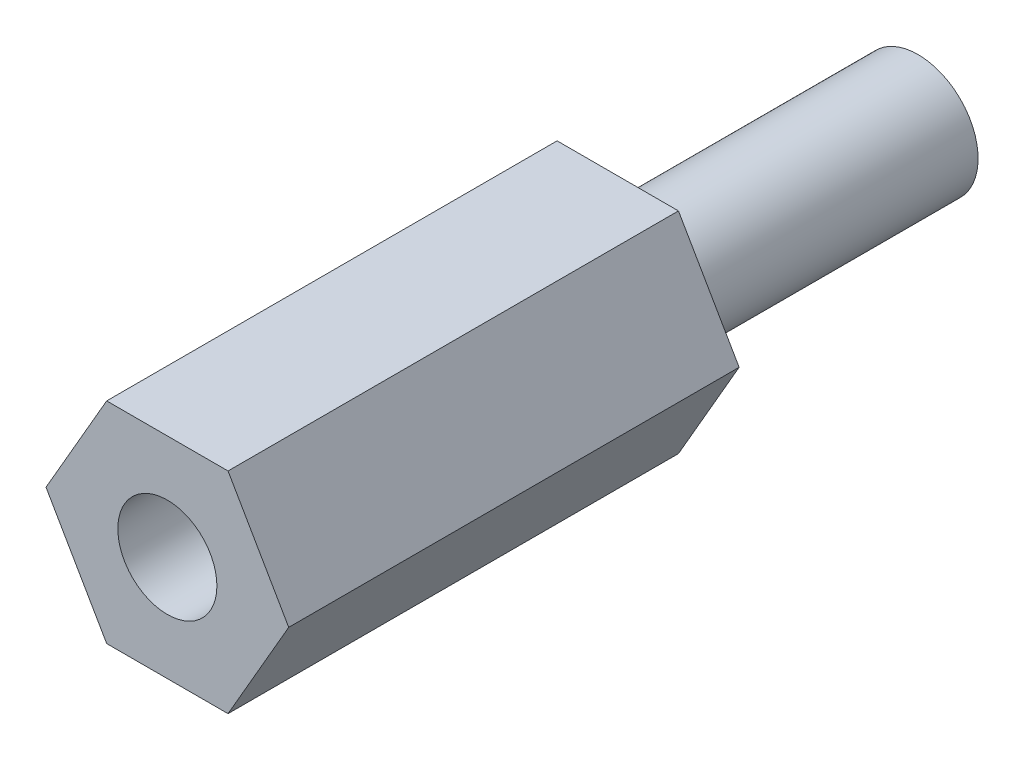
ISO-10303-21;
HEADER;
FILE_DESCRIPTION(('STEP AP214'),'2;1');
FILE_NAME('part.step','',(''),(''),'','','');
FILE_SCHEMA(('AUTOMOTIVE_DESIGN { 1 0 10303 214 1 1 1 1 }'));
ENDSEC;
DATA;
#1=APPLICATION_CONTEXT('core data for automotive mechanical design processes');
#2=APPLICATION_PROTOCOL_DEFINITION('international standard','automotive_design',2000,#1);
#3=PRODUCT_CONTEXT('',#1,'mechanical');
#4=PRODUCT('Part','Part','',(#3));
#5=PRODUCT_RELATED_PRODUCT_CATEGORY('part','',(#4));
#6=PRODUCT_DEFINITION_FORMATION('','',#4);
#7=PRODUCT_DEFINITION_CONTEXT('part definition',#1,'design');
#8=PRODUCT_DEFINITION('design','',#6,#7);
#9=PRODUCT_DEFINITION_SHAPE('','',#8);
#10=(LENGTH_UNIT() NAMED_UNIT(*) SI_UNIT(.MILLI.,.METRE.));
#11=(NAMED_UNIT(*) PLANE_ANGLE_UNIT() SI_UNIT($,.RADIAN.));
#12=(NAMED_UNIT(*) SI_UNIT($,.STERADIAN.) SOLID_ANGLE_UNIT());
#13=UNCERTAINTY_MEASURE_WITH_UNIT(LENGTH_MEASURE(1.E-05),#10,'distance_accuracy_value','');
#14=(GEOMETRIC_REPRESENTATION_CONTEXT(3) GLOBAL_UNCERTAINTY_ASSIGNED_CONTEXT((#13)) GLOBAL_UNIT_ASSIGNED_CONTEXT((#10,
#11,#12)) REPRESENTATION_CONTEXT('',''));
#15=CARTESIAN_POINT('',(0.,0.,0.));
#16=DIRECTION('',(0.,0.,1.));
#17=DIRECTION('',(1.,0.,0.));
#18=AXIS2_PLACEMENT_3D('',#15,#16,#17);
#19=CARTESIAN_POINT('',(2.02072594216369,3.5,15.));
#20=DIRECTION('',(0.,-1.,0.));
#21=DIRECTION('',(1.,0.,0.));
#22=AXIS2_PLACEMENT_3D('',#19,#20,#21);
#23=PLANE('',#22);
#24=DIRECTION('',(-1.,0.,0.));
#25=VECTOR('',#24,1.);
#26=CARTESIAN_POINT('',(2.02072594216369,3.5,0.));
#27=LINE('',#26,#25);
#28=CARTESIAN_POINT('',(2.02072594216369,3.5,0.));
#29=VERTEX_POINT('',#28);
#30=CARTESIAN_POINT('',(-2.02072594216369,3.5,0.));
#31=VERTEX_POINT('',#30);
#32=EDGE_CURVE('E125',#29,#31,#27,.T.);
#33=ORIENTED_EDGE('',*,*,#32,.T.);
#34=DIRECTION('',(0.,0.,-1.));
#35=VECTOR('',#34,1.);
#36=CARTESIAN_POINT('',(-2.02072594216369,3.5,15.));
#37=LINE('',#36,#35);
#38=CARTESIAN_POINT('',(-2.02072594216369,3.5,15.));
#39=VERTEX_POINT('',#38);
#40=EDGE_CURVE('E40',#39,#31,#37,.T.);
#41=ORIENTED_EDGE('',*,*,#40,.F.);
#42=DIRECTION('',(-1.,0.,0.));
#43=VECTOR('',#42,1.);
#44=CARTESIAN_POINT('',(2.02072594216369,3.5,15.));
#45=LINE('',#44,#43);
#46=CARTESIAN_POINT('',(2.02072594216369,3.5,15.));
#47=VERTEX_POINT('',#46);
#48=EDGE_CURVE('E136',#47,#39,#45,.T.);
#49=ORIENTED_EDGE('',*,*,#48,.F.);
#50=DIRECTION('',(0.,0.,-1.));
#51=VECTOR('',#50,1.);
#52=CARTESIAN_POINT('',(2.02072594216369,3.5,15.));
#53=LINE('',#52,#51);
#54=EDGE_CURVE('E121',#47,#29,#53,.T.);
#55=ORIENTED_EDGE('',*,*,#54,.T.);
#56=EDGE_LOOP('',(#33,#41,#49,#55));
#57=FACE_BOUND('',#56,.T.);
#58=ADVANCED_FACE('F37',(#57),#23,.F.);
#59=CARTESIAN_POINT('',(-2.02072594216369,3.5,15.));
#60=DIRECTION('',(0.866025403784439,-0.5,0.));
#61=DIRECTION('',(0.5,0.866025403784439,0.));
#62=AXIS2_PLACEMENT_3D('',#59,#60,#61);
#63=PLANE('',#62);
#64=DIRECTION('',(-0.5,-0.866025403784439,0.));
#65=VECTOR('',#64,1.);
#66=CARTESIAN_POINT('',(-2.02072594216369,3.5,0.));
#67=LINE('',#66,#65);
#68=CARTESIAN_POINT('',(-4.04145188432738,0.,0.));
#69=VERTEX_POINT('',#68);
#70=EDGE_CURVE('E128',#31,#69,#67,.T.);
#71=ORIENTED_EDGE('',*,*,#70,.T.);
#72=DIRECTION('',(0.,0.,-1.));
#73=VECTOR('',#72,1.);
#74=CARTESIAN_POINT('',(-4.04145188432738,0.,15.));
#75=LINE('',#74,#73);
#76=CARTESIAN_POINT('',(-4.04145188432738,0.,15.));
#77=VERTEX_POINT('',#76);
#78=EDGE_CURVE('E139',#77,#69,#75,.T.);
#79=ORIENTED_EDGE('',*,*,#78,.F.);
#80=DIRECTION('',(-0.5,-0.866025403784439,0.));
#81=VECTOR('',#80,1.);
#82=CARTESIAN_POINT('',(-2.02072594216369,3.5,15.));
#83=LINE('',#82,#81);
#84=EDGE_CURVE('E93',#39,#77,#83,.T.);
#85=ORIENTED_EDGE('',*,*,#84,.F.);
#86=ORIENTED_EDGE('',*,*,#40,.T.);
#87=EDGE_LOOP('',(#71,#79,#85,#86));
#88=FACE_BOUND('',#87,.T.);
#89=ADVANCED_FACE('F144',(#88),#63,.F.);
#90=CARTESIAN_POINT('',(-4.04145188432738,0.,15.));
#91=DIRECTION('',(0.866025403784439,0.5,0.));
#92=DIRECTION('',(-0.5,0.866025403784439,0.));
#93=AXIS2_PLACEMENT_3D('',#90,#91,#92);
#94=PLANE('',#93);
#95=DIRECTION('',(0.5,-0.866025403784439,0.));
#96=VECTOR('',#95,1.);
#97=CARTESIAN_POINT('',(-4.04145188432738,0.,0.));
#98=LINE('',#97,#96);
#99=CARTESIAN_POINT('',(-2.02072594216369,-3.5,0.));
#100=VERTEX_POINT('',#99);
#101=EDGE_CURVE('E131',#69,#100,#98,.T.);
#102=ORIENTED_EDGE('',*,*,#101,.T.);
#103=DIRECTION('',(0.,0.,-1.));
#104=VECTOR('',#103,1.);
#105=CARTESIAN_POINT('',(-2.02072594216369,-3.5,15.));
#106=LINE('',#105,#104);
#107=CARTESIAN_POINT('',(-2.02072594216369,-3.5,15.));
#108=VERTEX_POINT('',#107);
#109=EDGE_CURVE('E116',#108,#100,#106,.T.);
#110=ORIENTED_EDGE('',*,*,#109,.F.);
#111=DIRECTION('',(0.5,-0.866025403784439,0.));
#112=VECTOR('',#111,1.);
#113=CARTESIAN_POINT('',(-4.04145188432738,0.,15.));
#114=LINE('',#113,#112);
#115=EDGE_CURVE('E107',#77,#108,#114,.T.);
#116=ORIENTED_EDGE('',*,*,#115,.F.);
#117=ORIENTED_EDGE('',*,*,#78,.T.);
#118=EDGE_LOOP('',(#102,#110,#116,#117));
#119=FACE_BOUND('',#118,.T.);
#120=ADVANCED_FACE('F150',(#119),#94,.F.);
#121=CARTESIAN_POINT('',(-2.02072594216369,-3.5,15.));
#122=DIRECTION('',(0.,1.,0.));
#123=DIRECTION('',(-1.,0.,0.));
#124=AXIS2_PLACEMENT_3D('',#121,#122,#123);
#125=PLANE('',#124);
#126=DIRECTION('',(1.,0.,0.));
#127=VECTOR('',#126,1.);
#128=CARTESIAN_POINT('',(-2.02072594216369,-3.5,0.));
#129=LINE('',#128,#127);
#130=CARTESIAN_POINT('',(2.02072594216369,-3.5,0.));
#131=VERTEX_POINT('',#130);
#132=EDGE_CURVE('E115',#100,#131,#129,.T.);
#133=ORIENTED_EDGE('',*,*,#132,.T.);
#134=DIRECTION('',(0.,0.,-1.));
#135=VECTOR('',#134,1.);
#136=CARTESIAN_POINT('',(2.02072594216369,-3.5,15.));
#137=LINE('',#136,#135);
#138=CARTESIAN_POINT('',(2.02072594216369,-3.5,15.));
#139=VERTEX_POINT('',#138);
#140=EDGE_CURVE('E112',#139,#131,#137,.T.);
#141=ORIENTED_EDGE('',*,*,#140,.F.);
#142=DIRECTION('',(1.,0.,0.));
#143=VECTOR('',#142,1.);
#144=CARTESIAN_POINT('',(-2.02072594216369,-3.5,15.));
#145=LINE('',#144,#143);
#146=EDGE_CURVE('E101',#108,#139,#145,.T.);
#147=ORIENTED_EDGE('',*,*,#146,.F.);
#148=ORIENTED_EDGE('',*,*,#109,.T.);
#149=EDGE_LOOP('',(#133,#141,#147,#148));
#150=FACE_BOUND('',#149,.T.);
#151=ADVANCED_FACE('F113',(#150),#125,.F.);
#152=CARTESIAN_POINT('',(2.02072594216369,-3.5,15.));
#153=DIRECTION('',(-0.866025403784439,0.5,0.));
#154=DIRECTION('',(-0.5,-0.866025403784439,0.));
#155=AXIS2_PLACEMENT_3D('',#152,#153,#154);
#156=PLANE('',#155);
#157=DIRECTION('',(0.5,0.866025403784439,0.));
#158=VECTOR('',#157,1.);
#159=CARTESIAN_POINT('',(2.02072594216369,-3.5,0.));
#160=LINE('',#159,#158);
#161=CARTESIAN_POINT('',(4.04145188432738,0.,0.));
#162=VERTEX_POINT('',#161);
#163=EDGE_CURVE('E78',#131,#162,#160,.T.);
#164=ORIENTED_EDGE('',*,*,#163,.T.);
#165=DIRECTION('',(0.,0.,-1.));
#166=VECTOR('',#165,1.);
#167=CARTESIAN_POINT('',(4.04145188432738,0.,15.));
#168=LINE('',#167,#166);
#169=CARTESIAN_POINT('',(4.04145188432738,0.,15.));
#170=VERTEX_POINT('',#169);
#171=EDGE_CURVE('E117',#170,#162,#168,.T.);
#172=ORIENTED_EDGE('',*,*,#171,.F.);
#173=DIRECTION('',(0.5,0.866025403784439,0.));
#174=VECTOR('',#173,1.);
#175=CARTESIAN_POINT('',(2.02072594216369,-3.5,15.));
#176=LINE('',#175,#174);
#177=EDGE_CURVE('E105',#139,#170,#176,.T.);
#178=ORIENTED_EDGE('',*,*,#177,.F.);
#179=ORIENTED_EDGE('',*,*,#140,.T.);
#180=EDGE_LOOP('',(#164,#172,#178,#179));
#181=FACE_BOUND('',#180,.T.);
#182=ADVANCED_FACE('F119',(#181),#156,.F.);
#183=CARTESIAN_POINT('',(4.04145188432738,0.,15.));
#184=DIRECTION('',(-0.866025403784439,-0.5,0.));
#185=DIRECTION('',(0.5,-0.866025403784439,0.));
#186=AXIS2_PLACEMENT_3D('',#183,#184,#185);
#187=PLANE('',#186);
#188=DIRECTION('',(-0.5,0.866025403784438,0.));
#189=VECTOR('',#188,1.);
#190=CARTESIAN_POINT('',(4.04145188432738,0.,0.));
#191=LINE('',#190,#189);
#192=EDGE_CURVE('E84',#162,#29,#191,.T.);
#193=ORIENTED_EDGE('',*,*,#192,.T.);
#194=ORIENTED_EDGE('',*,*,#54,.F.);
#195=DIRECTION('',(-0.5,0.866025403784438,0.));
#196=VECTOR('',#195,1.);
#197=CARTESIAN_POINT('',(4.04145188432738,0.,15.));
#198=LINE('',#197,#196);
#199=EDGE_CURVE('E54',#170,#47,#198,.T.);
#200=ORIENTED_EDGE('',*,*,#199,.F.);
#201=ORIENTED_EDGE('',*,*,#171,.T.);
#202=EDGE_LOOP('',(#193,#194,#200,#201));
#203=FACE_BOUND('',#202,.T.);
#204=ADVANCED_FACE('F166',(#203),#187,.F.);
#205=CARTESIAN_POINT('',(0.,0.,15.));
#206=DIRECTION('',(0.,0.,1.));
#207=DIRECTION('',(1.,0.,0.));
#208=AXIS2_PLACEMENT_3D('',#205,#206,#207);
#209=PLANE('',#208);
#210=CARTESIAN_POINT('',(0.,0.,15.));
#211=DIRECTION('',(0.,0.,1.));
#212=DIRECTION('',(1.,0.,0.));
#213=AXIS2_PLACEMENT_3D('',#210,#211,#212);
#214=CIRCLE('',#213,1.65);
#215=CARTESIAN_POINT('',(1.65,0.,15.));
#216=VERTEX_POINT('',#215);
#217=EDGE_CURVE('E159',#216,#216,#214,.T.);
#218=ORIENTED_EDGE('',*,*,#217,.F.);
#219=EDGE_LOOP('',(#218));
#220=FACE_BOUND('',#219,.T.);
#221=ORIENTED_EDGE('',*,*,#48,.T.);
#222=ORIENTED_EDGE('',*,*,#84,.T.);
#223=ORIENTED_EDGE('',*,*,#115,.T.);
#224=ORIENTED_EDGE('',*,*,#146,.T.);
#225=ORIENTED_EDGE('',*,*,#177,.T.);
#226=ORIENTED_EDGE('',*,*,#199,.T.);
#227=EDGE_LOOP('',(#221,#222,#223,#224,#225,#226));
#228=FACE_BOUND('',#227,.T.);
#229=ADVANCED_FACE('F103',(#220,#228),#209,.T.);
#230=CARTESIAN_POINT('',(0.,0.,0.));
#231=DIRECTION('',(0.,0.,1.));
#232=DIRECTION('',(1.,0.,0.));
#233=AXIS2_PLACEMENT_3D('',#230,#231,#232);
#234=PLANE('',#233);
#235=CARTESIAN_POINT('',(0.,0.,0.));
#236=DIRECTION('',(0.,0.,-1.));
#237=DIRECTION('',(-1.,0.,0.));
#238=AXIS2_PLACEMENT_3D('',#235,#236,#237);
#239=CIRCLE('',#238,2.);
#240=CARTESIAN_POINT('',(-2.,0.,0.));
#241=VERTEX_POINT('',#240);
#242=EDGE_CURVE('E11',#241,#241,#239,.T.);
#243=ORIENTED_EDGE('',*,*,#242,.F.);
#244=EDGE_LOOP('',(#243));
#245=FACE_BOUND('',#244,.T.);
#246=ORIENTED_EDGE('',*,*,#32,.F.);
#247=ORIENTED_EDGE('',*,*,#192,.F.);
#248=ORIENTED_EDGE('',*,*,#163,.F.);
#249=ORIENTED_EDGE('',*,*,#132,.F.);
#250=ORIENTED_EDGE('',*,*,#101,.F.);
#251=ORIENTED_EDGE('',*,*,#70,.F.);
#252=EDGE_LOOP('',(#246,#247,#248,#249,#250,#251));
#253=FACE_BOUND('',#252,.T.);
#254=ADVANCED_FACE('F149',(#245,#253),#234,.F.);
#255=CARTESIAN_POINT('',(0.,0.,-10.));
#256=DIRECTION('',(0.,0.,1.));
#257=DIRECTION('',(1.,0.,0.));
#258=AXIS2_PLACEMENT_3D('',#255,#256,#257);
#259=CYLINDRICAL_SURFACE('',#258,2.);
#260=CARTESIAN_POINT('',(0.,0.,-10.));
#261=DIRECTION('',(0.,0.,-1.));
#262=DIRECTION('',(-1.,0.,0.));
#263=AXIS2_PLACEMENT_3D('',#260,#261,#262);
#264=CIRCLE('',#263,2.);
#265=CARTESIAN_POINT('',(-2.,0.,-10.));
#266=VERTEX_POINT('',#265);
#267=EDGE_CURVE('E129',#266,#266,#264,.T.);
#268=ORIENTED_EDGE('',*,*,#267,.F.);
#269=EDGE_LOOP('',(#268));
#270=FACE_BOUND('',#269,.T.);
#271=ORIENTED_EDGE('',*,*,#242,.T.);
#272=EDGE_LOOP('',(#271));
#273=FACE_BOUND('',#272,.T.);
#274=ADVANCED_FACE('F172',(#270,#273),#259,.T.);
#275=CARTESIAN_POINT('',(0.,0.,-10.));
#276=DIRECTION('',(0.,0.,-1.));
#277=DIRECTION('',(-1.,0.,0.));
#278=AXIS2_PLACEMENT_3D('',#275,#276,#277);
#279=PLANE('',#278);
#280=ORIENTED_EDGE('',*,*,#267,.T.);
#281=EDGE_LOOP('',(#280));
#282=FACE_BOUND('',#281,.T.);
#283=ADVANCED_FACE('F213',(#282),#279,.T.);
#284=CARTESIAN_POINT('',(0.,0.,4.9));
#285=DIRECTION('',(0.,0.,1.));
#286=DIRECTION('',(1.,0.,0.));
#287=AXIS2_PLACEMENT_3D('',#284,#285,#286);
#288=CONICAL_SURFACE('',#287,1.65,1.02974425867665);
#289=CARTESIAN_POINT('',(0.,0.,3.90857997860452));
#290=VERTEX_POINT('',#289);
#291=VERTEX_LOOP('',#290);
#292=FACE_BOUND('',#291,.T.);
#293=CARTESIAN_POINT('',(0.,0.,4.9));
#294=DIRECTION('',(0.,0.,1.));
#295=DIRECTION('',(1.,0.,0.));
#296=AXIS2_PLACEMENT_3D('',#293,#294,#295);
#297=CIRCLE('',#296,1.65);
#298=CARTESIAN_POINT('',(1.65,0.,4.9));
#299=VERTEX_POINT('',#298);
#300=EDGE_CURVE('E156',#299,#299,#297,.T.);
#301=ORIENTED_EDGE('',*,*,#300,.T.);
#302=EDGE_LOOP('',(#301));
#303=FACE_BOUND('',#302,.T.);
#304=ADVANCED_FACE('F221',(#292,#303),#288,.F.);
#305=CARTESIAN_POINT('',(0.,0.,15.));
#306=DIRECTION('',(0.,0.,1.));
#307=DIRECTION('',(1.,0.,0.));
#308=AXIS2_PLACEMENT_3D('',#305,#306,#307);
#309=CYLINDRICAL_SURFACE('',#308,1.65);
#310=ORIENTED_EDGE('',*,*,#300,.F.);
#311=EDGE_LOOP('',(#310));
#312=FACE_BOUND('',#311,.T.);
#313=ORIENTED_EDGE('',*,*,#217,.T.);
#314=EDGE_LOOP('',(#313));
#315=FACE_BOUND('',#314,.T.);
#316=ADVANCED_FACE('F163',(#312,#315),#309,.F.);
#317=CLOSED_SHELL('',(#58,#89,#120,#151,#182,#204,#229,#254,#274,#283,#304,#316));
#318=MANIFOLD_SOLID_BREP('B2',#317);
#319=ADVANCED_BREP_SHAPE_REPRESENTATION('',(#18,#318),#14);
#320=SHAPE_DEFINITION_REPRESENTATION(#9,#319);
ENDSEC;
END-ISO-10303-21;
